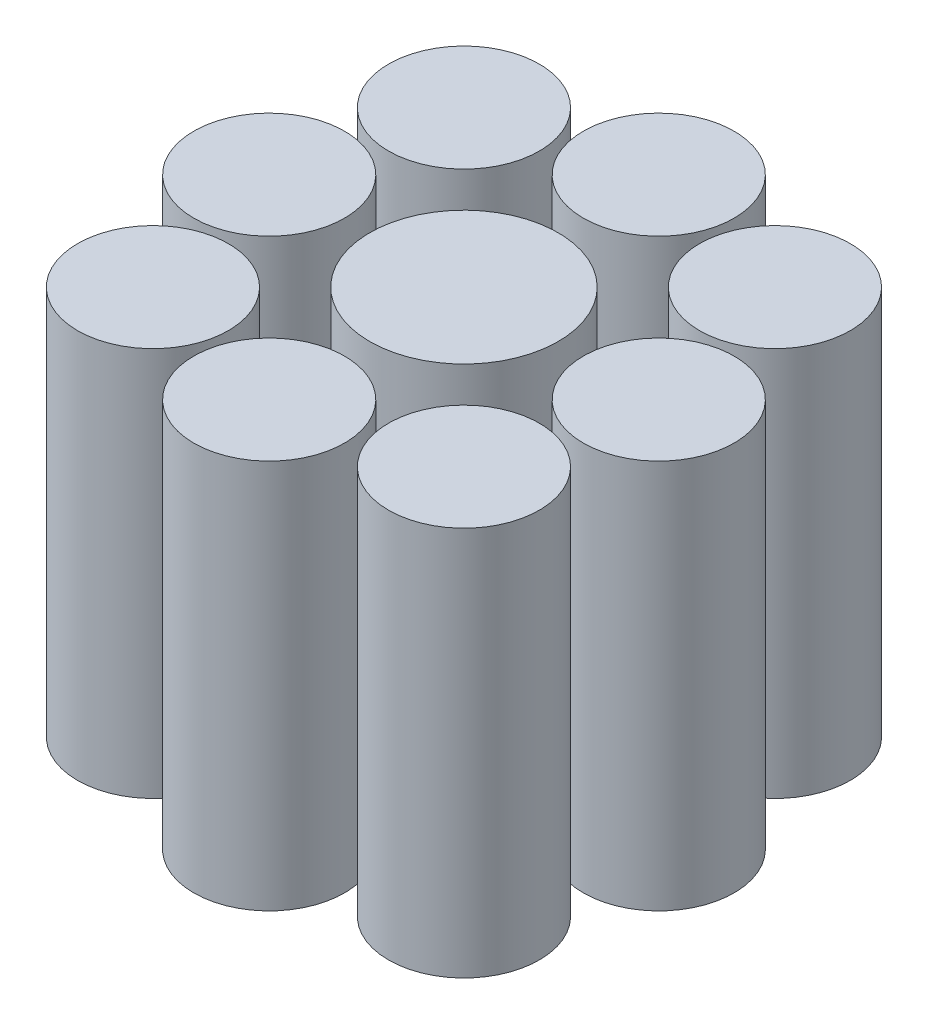
ISO-10303-21;
HEADER;
FILE_DESCRIPTION(('STEP AP214'),'2;1');
FILE_NAME('part.step','',(''),(''),'','','');
FILE_SCHEMA(('AUTOMOTIVE_DESIGN { 1 0 10303 214 1 1 1 1 }'));
ENDSEC;
DATA;
#1=APPLICATION_CONTEXT('core data for automotive mechanical design processes');
#2=APPLICATION_PROTOCOL_DEFINITION('international standard','automotive_design',2000,#1);
#3=PRODUCT_CONTEXT('',#1,'mechanical');
#4=PRODUCT('Part','Part','',(#3));
#5=PRODUCT_RELATED_PRODUCT_CATEGORY('part','',(#4));
#6=PRODUCT_DEFINITION_FORMATION('','',#4);
#7=PRODUCT_DEFINITION_CONTEXT('part definition',#1,'design');
#8=PRODUCT_DEFINITION('design','',#6,#7);
#9=PRODUCT_DEFINITION_SHAPE('','',#8);
#10=(LENGTH_UNIT() NAMED_UNIT(*) SI_UNIT(.MILLI.,.METRE.));
#11=(NAMED_UNIT(*) PLANE_ANGLE_UNIT() SI_UNIT($,.RADIAN.));
#12=(NAMED_UNIT(*) SI_UNIT($,.STERADIAN.) SOLID_ANGLE_UNIT());
#13=UNCERTAINTY_MEASURE_WITH_UNIT(LENGTH_MEASURE(1.E-05),#10,'distance_accuracy_value','');
#14=(GEOMETRIC_REPRESENTATION_CONTEXT(3) GLOBAL_UNCERTAINTY_ASSIGNED_CONTEXT((#13)) GLOBAL_UNIT_ASSIGNED_CONTEXT((#10,
#11,#12)) REPRESENTATION_CONTEXT('',''));
#15=CARTESIAN_POINT('',(0.,0.,0.));
#16=DIRECTION('',(0.,0.,1.));
#17=DIRECTION('',(1.,0.,0.));
#18=AXIS2_PLACEMENT_3D('',#15,#16,#17);
#19=CARTESIAN_POINT('',(24.7487373415292,62.,-24.7487373415291));
#20=DIRECTION('',(0.,-1.,0.));
#21=DIRECTION('',(0.,0.,-1.));
#22=AXIS2_PLACEMENT_3D('',#19,#20,#21);
#23=CYLINDRICAL_SURFACE('',#22,12.);
#24=CARTESIAN_POINT('',(24.7487373415292,62.,-24.7487373415291));
#25=DIRECTION('',(0.,1.,0.));
#26=DIRECTION('',(0.,0.,1.));
#27=AXIS2_PLACEMENT_3D('',#24,#25,#26);
#28=CIRCLE('',#27,12.);
#29=CARTESIAN_POINT('',(24.7487373415292,62.,-12.7487373415291));
#30=VERTEX_POINT('',#29);
#31=EDGE_CURVE('E11',#30,#30,#28,.T.);
#32=ORIENTED_EDGE('',*,*,#31,.F.);
#33=EDGE_LOOP('',(#32));
#34=FACE_BOUND('',#33,.T.);
#35=CARTESIAN_POINT('',(24.7487373415292,0.,-24.7487373415291));
#36=DIRECTION('',(0.,1.,0.));
#37=DIRECTION('',(0.,0.,1.));
#38=AXIS2_PLACEMENT_3D('',#35,#36,#37);
#39=CIRCLE('',#38,12.);
#40=CARTESIAN_POINT('',(24.7487373415292,0.,-12.7487373415291));
#41=VERTEX_POINT('',#40);
#42=EDGE_CURVE('E44',#41,#41,#39,.T.);
#43=ORIENTED_EDGE('',*,*,#42,.T.);
#44=EDGE_LOOP('',(#43));
#45=FACE_BOUND('',#44,.T.);
#46=ADVANCED_FACE('F41',(#34,#45),#23,.T.);
#47=CARTESIAN_POINT('',(24.7487373415292,62.,-24.7487373415291));
#48=DIRECTION('',(0.,1.,0.));
#49=DIRECTION('',(0.,0.,1.));
#50=AXIS2_PLACEMENT_3D('',#47,#48,#49);
#51=PLANE('',#50);
#52=ORIENTED_EDGE('',*,*,#31,.T.);
#53=EDGE_LOOP('',(#52));
#54=FACE_BOUND('',#53,.T.);
#55=ADVANCED_FACE('F56',(#54),#51,.T.);
#56=CARTESIAN_POINT('',(24.7487373415292,0.,-24.7487373415291));
#57=DIRECTION('',(0.,1.,0.));
#58=DIRECTION('',(0.,0.,1.));
#59=AXIS2_PLACEMENT_3D('',#56,#57,#58);
#60=PLANE('',#59);
#61=ORIENTED_EDGE('',*,*,#42,.F.);
#62=EDGE_LOOP('',(#61));
#63=FACE_BOUND('',#62,.T.);
#64=ADVANCED_FACE('F54',(#63),#60,.F.);
#65=CLOSED_SHELL('',(#46,#55,#64));
#66=MANIFOLD_SOLID_BREP('B2',#65);
#67=CARTESIAN_POINT('',(-24.7487373415291,62.,-24.7487373415292));
#68=DIRECTION('',(0.,-1.,0.));
#69=DIRECTION('',(0.,0.,-1.));
#70=AXIS2_PLACEMENT_3D('',#67,#68,#69);
#71=CYLINDRICAL_SURFACE('',#70,12.);
#72=CARTESIAN_POINT('',(-24.7487373415291,62.,-24.7487373415292));
#73=DIRECTION('',(0.,1.,0.));
#74=DIRECTION('',(0.,0.,1.));
#75=AXIS2_PLACEMENT_3D('',#72,#73,#74);
#76=CIRCLE('',#75,12.);
#77=CARTESIAN_POINT('',(-24.7487373415291,62.,-12.7487373415292));
#78=VERTEX_POINT('',#77);
#79=EDGE_CURVE('E40',#78,#78,#76,.T.);
#80=ORIENTED_EDGE('',*,*,#79,.F.);
#81=EDGE_LOOP('',(#80));
#82=FACE_BOUND('',#81,.T.);
#83=CARTESIAN_POINT('',(-24.7487373415291,0.,-24.7487373415292));
#84=DIRECTION('',(0.,1.,0.));
#85=DIRECTION('',(0.,0.,1.));
#86=AXIS2_PLACEMENT_3D('',#83,#84,#85);
#87=CIRCLE('',#86,12.);
#88=CARTESIAN_POINT('',(-24.7487373415291,0.,-12.7487373415292));
#89=VERTEX_POINT('',#88);
#90=EDGE_CURVE('E92',#89,#89,#87,.T.);
#91=ORIENTED_EDGE('',*,*,#90,.T.);
#92=EDGE_LOOP('',(#91));
#93=FACE_BOUND('',#92,.T.);
#94=ADVANCED_FACE('F89',(#82,#93),#71,.T.);
#95=CARTESIAN_POINT('',(-24.7487373415291,62.,-24.7487373415292));
#96=DIRECTION('',(0.,1.,0.));
#97=DIRECTION('',(0.,0.,1.));
#98=AXIS2_PLACEMENT_3D('',#95,#96,#97);
#99=PLANE('',#98);
#100=ORIENTED_EDGE('',*,*,#79,.T.);
#101=EDGE_LOOP('',(#100));
#102=FACE_BOUND('',#101,.T.);
#103=ADVANCED_FACE('F104',(#102),#99,.T.);
#104=CARTESIAN_POINT('',(-24.7487373415291,0.,-24.7487373415292));
#105=DIRECTION('',(0.,1.,0.));
#106=DIRECTION('',(0.,0.,1.));
#107=AXIS2_PLACEMENT_3D('',#104,#105,#106);
#108=PLANE('',#107);
#109=ORIENTED_EDGE('',*,*,#90,.F.);
#110=EDGE_LOOP('',(#109));
#111=FACE_BOUND('',#110,.T.);
#112=ADVANCED_FACE('F102',(#111),#108,.F.);
#113=CLOSED_SHELL('',(#94,#103,#112));
#114=MANIFOLD_SOLID_BREP('B6',#113);
#115=CARTESIAN_POINT('',(-24.7487373415292,62.,24.7487373415291));
#116=DIRECTION('',(0.,-1.,0.));
#117=DIRECTION('',(0.,0.,-1.));
#118=AXIS2_PLACEMENT_3D('',#115,#116,#117);
#119=CYLINDRICAL_SURFACE('',#118,12.);
#120=CARTESIAN_POINT('',(-24.7487373415292,62.,24.7487373415291));
#121=DIRECTION('',(0.,1.,0.));
#122=DIRECTION('',(0.,0.,1.));
#123=AXIS2_PLACEMENT_3D('',#120,#121,#122);
#124=CIRCLE('',#123,12.);
#125=CARTESIAN_POINT('',(-24.7487373415292,62.,36.7487373415291));
#126=VERTEX_POINT('',#125);
#127=EDGE_CURVE('E88',#126,#126,#124,.T.);
#128=ORIENTED_EDGE('',*,*,#127,.F.);
#129=EDGE_LOOP('',(#128));
#130=FACE_BOUND('',#129,.T.);
#131=CARTESIAN_POINT('',(-24.7487373415292,0.,24.7487373415291));
#132=DIRECTION('',(0.,1.,0.));
#133=DIRECTION('',(0.,0.,1.));
#134=AXIS2_PLACEMENT_3D('',#131,#132,#133);
#135=CIRCLE('',#134,12.);
#136=CARTESIAN_POINT('',(-24.7487373415292,0.,36.7487373415291));
#137=VERTEX_POINT('',#136);
#138=EDGE_CURVE('E140',#137,#137,#135,.T.);
#139=ORIENTED_EDGE('',*,*,#138,.T.);
#140=EDGE_LOOP('',(#139));
#141=FACE_BOUND('',#140,.T.);
#142=ADVANCED_FACE('F137',(#130,#141),#119,.T.);
#143=CARTESIAN_POINT('',(-24.7487373415292,62.,24.7487373415291));
#144=DIRECTION('',(0.,1.,0.));
#145=DIRECTION('',(0.,0.,1.));
#146=AXIS2_PLACEMENT_3D('',#143,#144,#145);
#147=PLANE('',#146);
#148=ORIENTED_EDGE('',*,*,#127,.T.);
#149=EDGE_LOOP('',(#148));
#150=FACE_BOUND('',#149,.T.);
#151=ADVANCED_FACE('F152',(#150),#147,.T.);
#152=CARTESIAN_POINT('',(-24.7487373415292,0.,24.7487373415291));
#153=DIRECTION('',(0.,1.,0.));
#154=DIRECTION('',(0.,0.,1.));
#155=AXIS2_PLACEMENT_3D('',#152,#153,#154);
#156=PLANE('',#155);
#157=ORIENTED_EDGE('',*,*,#138,.F.);
#158=EDGE_LOOP('',(#157));
#159=FACE_BOUND('',#158,.T.);
#160=ADVANCED_FACE('F150',(#159),#156,.F.);
#161=CLOSED_SHELL('',(#142,#151,#160));
#162=MANIFOLD_SOLID_BREP('B35',#161);
#163=CARTESIAN_POINT('',(0.,62.,-31.));
#164=DIRECTION('',(0.,-1.,0.));
#165=DIRECTION('',(0.,0.,-1.));
#166=AXIS2_PLACEMENT_3D('',#163,#164,#165);
#167=CYLINDRICAL_SURFACE('',#166,12.);
#168=CARTESIAN_POINT('',(0.,62.,-31.));
#169=DIRECTION('',(0.,1.,0.));
#170=DIRECTION('',(0.,0.,1.));
#171=AXIS2_PLACEMENT_3D('',#168,#169,#170);
#172=CIRCLE('',#171,12.);
#173=CARTESIAN_POINT('',(0.,62.,-19.));
#174=VERTEX_POINT('',#173);
#175=EDGE_CURVE('E136',#174,#174,#172,.T.);
#176=ORIENTED_EDGE('',*,*,#175,.F.);
#177=EDGE_LOOP('',(#176));
#178=FACE_BOUND('',#177,.T.);
#179=CARTESIAN_POINT('',(0.,0.,-31.));
#180=DIRECTION('',(0.,1.,0.));
#181=DIRECTION('',(0.,0.,1.));
#182=AXIS2_PLACEMENT_3D('',#179,#180,#181);
#183=CIRCLE('',#182,12.);
#184=CARTESIAN_POINT('',(0.,0.,-19.));
#185=VERTEX_POINT('',#184);
#186=EDGE_CURVE('E188',#185,#185,#183,.T.);
#187=ORIENTED_EDGE('',*,*,#186,.T.);
#188=EDGE_LOOP('',(#187));
#189=FACE_BOUND('',#188,.T.);
#190=ADVANCED_FACE('F185',(#178,#189),#167,.T.);
#191=CARTESIAN_POINT('',(0.,62.,-31.));
#192=DIRECTION('',(0.,1.,0.));
#193=DIRECTION('',(0.,0.,1.));
#194=AXIS2_PLACEMENT_3D('',#191,#192,#193);
#195=PLANE('',#194);
#196=ORIENTED_EDGE('',*,*,#175,.T.);
#197=EDGE_LOOP('',(#196));
#198=FACE_BOUND('',#197,.T.);
#199=ADVANCED_FACE('F200',(#198),#195,.T.);
#200=CARTESIAN_POINT('',(0.,0.,-31.));
#201=DIRECTION('',(0.,1.,0.));
#202=DIRECTION('',(0.,0.,1.));
#203=AXIS2_PLACEMENT_3D('',#200,#201,#202);
#204=PLANE('',#203);
#205=ORIENTED_EDGE('',*,*,#186,.F.);
#206=EDGE_LOOP('',(#205));
#207=FACE_BOUND('',#206,.T.);
#208=ADVANCED_FACE('F198',(#207),#204,.F.);
#209=CLOSED_SHELL('',(#190,#199,#208));
#210=MANIFOLD_SOLID_BREP('B83',#209);
#211=CARTESIAN_POINT('',(-31.,62.,0.));
#212=DIRECTION('',(0.,-1.,0.));
#213=DIRECTION('',(0.,0.,-1.));
#214=AXIS2_PLACEMENT_3D('',#211,#212,#213);
#215=CYLINDRICAL_SURFACE('',#214,12.);
#216=CARTESIAN_POINT('',(-31.,62.,0.));
#217=DIRECTION('',(0.,1.,0.));
#218=DIRECTION('',(0.,0.,1.));
#219=AXIS2_PLACEMENT_3D('',#216,#217,#218);
#220=CIRCLE('',#219,12.);
#221=CARTESIAN_POINT('',(-31.,62.,12.));
#222=VERTEX_POINT('',#221);
#223=EDGE_CURVE('E184',#222,#222,#220,.T.);
#224=ORIENTED_EDGE('',*,*,#223,.F.);
#225=EDGE_LOOP('',(#224));
#226=FACE_BOUND('',#225,.T.);
#227=CARTESIAN_POINT('',(-31.,0.,0.));
#228=DIRECTION('',(0.,1.,0.));
#229=DIRECTION('',(0.,0.,1.));
#230=AXIS2_PLACEMENT_3D('',#227,#228,#229);
#231=CIRCLE('',#230,12.);
#232=CARTESIAN_POINT('',(-31.,0.,12.));
#233=VERTEX_POINT('',#232);
#234=EDGE_CURVE('E236',#233,#233,#231,.T.);
#235=ORIENTED_EDGE('',*,*,#234,.T.);
#236=EDGE_LOOP('',(#235));
#237=FACE_BOUND('',#236,.T.);
#238=ADVANCED_FACE('F233',(#226,#237),#215,.T.);
#239=CARTESIAN_POINT('',(-31.,62.,0.));
#240=DIRECTION('',(0.,1.,0.));
#241=DIRECTION('',(0.,0.,1.));
#242=AXIS2_PLACEMENT_3D('',#239,#240,#241);
#243=PLANE('',#242);
#244=ORIENTED_EDGE('',*,*,#223,.T.);
#245=EDGE_LOOP('',(#244));
#246=FACE_BOUND('',#245,.T.);
#247=ADVANCED_FACE('F248',(#246),#243,.T.);
#248=CARTESIAN_POINT('',(-31.,0.,0.));
#249=DIRECTION('',(0.,1.,0.));
#250=DIRECTION('',(0.,0.,1.));
#251=AXIS2_PLACEMENT_3D('',#248,#249,#250);
#252=PLANE('',#251);
#253=ORIENTED_EDGE('',*,*,#234,.F.);
#254=EDGE_LOOP('',(#253));
#255=FACE_BOUND('',#254,.T.);
#256=ADVANCED_FACE('F246',(#255),#252,.F.);
#257=CLOSED_SHELL('',(#238,#247,#256));
#258=MANIFOLD_SOLID_BREP('B131',#257);
#259=CARTESIAN_POINT('',(0.,62.,31.));
#260=DIRECTION('',(0.,-1.,0.));
#261=DIRECTION('',(0.,0.,-1.));
#262=AXIS2_PLACEMENT_3D('',#259,#260,#261);
#263=CYLINDRICAL_SURFACE('',#262,12.);
#264=CARTESIAN_POINT('',(0.,62.,31.));
#265=DIRECTION('',(0.,1.,0.));
#266=DIRECTION('',(0.,0.,1.));
#267=AXIS2_PLACEMENT_3D('',#264,#265,#266);
#268=CIRCLE('',#267,12.);
#269=CARTESIAN_POINT('',(0.,62.,43.));
#270=VERTEX_POINT('',#269);
#271=EDGE_CURVE('E232',#270,#270,#268,.T.);
#272=ORIENTED_EDGE('',*,*,#271,.F.);
#273=EDGE_LOOP('',(#272));
#274=FACE_BOUND('',#273,.T.);
#275=CARTESIAN_POINT('',(0.,0.,31.));
#276=DIRECTION('',(0.,1.,0.));
#277=DIRECTION('',(0.,0.,1.));
#278=AXIS2_PLACEMENT_3D('',#275,#276,#277);
#279=CIRCLE('',#278,12.);
#280=CARTESIAN_POINT('',(0.,0.,43.));
#281=VERTEX_POINT('',#280);
#282=EDGE_CURVE('E284',#281,#281,#279,.T.);
#283=ORIENTED_EDGE('',*,*,#282,.T.);
#284=EDGE_LOOP('',(#283));
#285=FACE_BOUND('',#284,.T.);
#286=ADVANCED_FACE('F281',(#274,#285),#263,.T.);
#287=CARTESIAN_POINT('',(0.,62.,31.));
#288=DIRECTION('',(0.,1.,0.));
#289=DIRECTION('',(0.,0.,1.));
#290=AXIS2_PLACEMENT_3D('',#287,#288,#289);
#291=PLANE('',#290);
#292=ORIENTED_EDGE('',*,*,#271,.T.);
#293=EDGE_LOOP('',(#292));
#294=FACE_BOUND('',#293,.T.);
#295=ADVANCED_FACE('F296',(#294),#291,.T.);
#296=CARTESIAN_POINT('',(0.,0.,31.));
#297=DIRECTION('',(0.,1.,0.));
#298=DIRECTION('',(0.,0.,1.));
#299=AXIS2_PLACEMENT_3D('',#296,#297,#298);
#300=PLANE('',#299);
#301=ORIENTED_EDGE('',*,*,#282,.F.);
#302=EDGE_LOOP('',(#301));
#303=FACE_BOUND('',#302,.T.);
#304=ADVANCED_FACE('F294',(#303),#300,.F.);
#305=CLOSED_SHELL('',(#286,#295,#304));
#306=MANIFOLD_SOLID_BREP('B179',#305);
#307=CARTESIAN_POINT('',(24.7487373415291,62.,24.7487373415292));
#308=DIRECTION('',(0.,-1.,0.));
#309=DIRECTION('',(0.,0.,-1.));
#310=AXIS2_PLACEMENT_3D('',#307,#308,#309);
#311=CYLINDRICAL_SURFACE('',#310,12.);
#312=CARTESIAN_POINT('',(24.7487373415291,62.,24.7487373415292));
#313=DIRECTION('',(0.,1.,0.));
#314=DIRECTION('',(0.,0.,1.));
#315=AXIS2_PLACEMENT_3D('',#312,#313,#314);
#316=CIRCLE('',#315,12.);
#317=CARTESIAN_POINT('',(24.7487373415291,62.,36.7487373415292));
#318=VERTEX_POINT('',#317);
#319=EDGE_CURVE('E280',#318,#318,#316,.T.);
#320=ORIENTED_EDGE('',*,*,#319,.F.);
#321=EDGE_LOOP('',(#320));
#322=FACE_BOUND('',#321,.T.);
#323=CARTESIAN_POINT('',(24.7487373415291,0.,24.7487373415292));
#324=DIRECTION('',(0.,1.,0.));
#325=DIRECTION('',(0.,0.,1.));
#326=AXIS2_PLACEMENT_3D('',#323,#324,#325);
#327=CIRCLE('',#326,12.);
#328=CARTESIAN_POINT('',(24.7487373415291,0.,36.7487373415292));
#329=VERTEX_POINT('',#328);
#330=EDGE_CURVE('E332',#329,#329,#327,.T.);
#331=ORIENTED_EDGE('',*,*,#330,.T.);
#332=EDGE_LOOP('',(#331));
#333=FACE_BOUND('',#332,.T.);
#334=ADVANCED_FACE('F329',(#322,#333),#311,.T.);
#335=CARTESIAN_POINT('',(24.7487373415291,62.,24.7487373415292));
#336=DIRECTION('',(0.,1.,0.));
#337=DIRECTION('',(0.,0.,1.));
#338=AXIS2_PLACEMENT_3D('',#335,#336,#337);
#339=PLANE('',#338);
#340=ORIENTED_EDGE('',*,*,#319,.T.);
#341=EDGE_LOOP('',(#340));
#342=FACE_BOUND('',#341,.T.);
#343=ADVANCED_FACE('F344',(#342),#339,.T.);
#344=CARTESIAN_POINT('',(24.7487373415291,0.,24.7487373415292));
#345=DIRECTION('',(0.,1.,0.));
#346=DIRECTION('',(0.,0.,1.));
#347=AXIS2_PLACEMENT_3D('',#344,#345,#346);
#348=PLANE('',#347);
#349=ORIENTED_EDGE('',*,*,#330,.F.);
#350=EDGE_LOOP('',(#349));
#351=FACE_BOUND('',#350,.T.);
#352=ADVANCED_FACE('F342',(#351),#348,.F.);
#353=CLOSED_SHELL('',(#334,#343,#352));
#354=MANIFOLD_SOLID_BREP('B227',#353);
#355=CARTESIAN_POINT('',(31.,62.,0.));
#356=DIRECTION('',(0.,-1.,0.));
#357=DIRECTION('',(0.,0.,-1.));
#358=AXIS2_PLACEMENT_3D('',#355,#356,#357);
#359=CYLINDRICAL_SURFACE('',#358,12.);
#360=CARTESIAN_POINT('',(31.,62.,0.));
#361=DIRECTION('',(0.,1.,0.));
#362=DIRECTION('',(0.,0.,1.));
#363=AXIS2_PLACEMENT_3D('',#360,#361,#362);
#364=CIRCLE('',#363,12.);
#365=CARTESIAN_POINT('',(31.,62.,12.));
#366=VERTEX_POINT('',#365);
#367=EDGE_CURVE('E328',#366,#366,#364,.T.);
#368=ORIENTED_EDGE('',*,*,#367,.F.);
#369=EDGE_LOOP('',(#368));
#370=FACE_BOUND('',#369,.T.);
#371=CARTESIAN_POINT('',(31.,0.,0.));
#372=DIRECTION('',(0.,1.,0.));
#373=DIRECTION('',(0.,0.,1.));
#374=AXIS2_PLACEMENT_3D('',#371,#372,#373);
#375=CIRCLE('',#374,12.);
#376=CARTESIAN_POINT('',(31.,0.,12.));
#377=VERTEX_POINT('',#376);
#378=EDGE_CURVE('E379',#377,#377,#375,.T.);
#379=ORIENTED_EDGE('',*,*,#378,.T.);
#380=EDGE_LOOP('',(#379));
#381=FACE_BOUND('',#380,.T.);
#382=ADVANCED_FACE('F376',(#370,#381),#359,.T.);
#383=CARTESIAN_POINT('',(31.,62.,0.));
#384=DIRECTION('',(0.,1.,0.));
#385=DIRECTION('',(0.,0.,1.));
#386=AXIS2_PLACEMENT_3D('',#383,#384,#385);
#387=PLANE('',#386);
#388=ORIENTED_EDGE('',*,*,#367,.T.);
#389=EDGE_LOOP('',(#388));
#390=FACE_BOUND('',#389,.T.);
#391=ADVANCED_FACE('F391',(#390),#387,.T.);
#392=CARTESIAN_POINT('',(31.,0.,0.));
#393=DIRECTION('',(0.,1.,0.));
#394=DIRECTION('',(0.,0.,1.));
#395=AXIS2_PLACEMENT_3D('',#392,#393,#394);
#396=PLANE('',#395);
#397=ORIENTED_EDGE('',*,*,#378,.F.);
#398=EDGE_LOOP('',(#397));
#399=FACE_BOUND('',#398,.T.);
#400=ADVANCED_FACE('F389',(#399),#396,.F.);
#401=CLOSED_SHELL('',(#382,#391,#400));
#402=MANIFOLD_SOLID_BREP('B275',#401);
#403=CARTESIAN_POINT('',(0.,62.,0.));
#404=DIRECTION('',(0.,-1.,0.));
#405=DIRECTION('',(0.,0.,-1.));
#406=AXIS2_PLACEMENT_3D('',#403,#404,#405);
#407=CYLINDRICAL_SURFACE('',#406,15.);
#408=CARTESIAN_POINT('',(0.,62.,0.));
#409=DIRECTION('',(0.,1.,0.));
#410=DIRECTION('',(0.,0.,1.));
#411=AXIS2_PLACEMENT_3D('',#408,#409,#410);
#412=CIRCLE('',#411,15.);
#413=CARTESIAN_POINT('',(0.,62.,15.));
#414=VERTEX_POINT('',#413);
#415=EDGE_CURVE('E375',#414,#414,#412,.T.);
#416=ORIENTED_EDGE('',*,*,#415,.F.);
#417=EDGE_LOOP('',(#416));
#418=FACE_BOUND('',#417,.T.);
#419=CARTESIAN_POINT('',(0.,0.,0.));
#420=DIRECTION('',(0.,1.,0.));
#421=DIRECTION('',(0.,0.,1.));
#422=AXIS2_PLACEMENT_3D('',#419,#420,#421);
#423=CIRCLE('',#422,15.);
#424=CARTESIAN_POINT('',(0.,0.,15.));
#425=VERTEX_POINT('',#424);
#426=EDGE_CURVE('E419',#425,#425,#423,.T.);
#427=ORIENTED_EDGE('',*,*,#426,.T.);
#428=EDGE_LOOP('',(#427));
#429=FACE_BOUND('',#428,.T.);
#430=ADVANCED_FACE('F416',(#418,#429),#407,.T.);
#431=CARTESIAN_POINT('',(0.,62.,0.));
#432=DIRECTION('',(0.,1.,0.));
#433=DIRECTION('',(0.,0.,1.));
#434=AXIS2_PLACEMENT_3D('',#431,#432,#433);
#435=PLANE('',#434);
#436=ORIENTED_EDGE('',*,*,#415,.T.);
#437=EDGE_LOOP('',(#436));
#438=FACE_BOUND('',#437,.T.);
#439=ADVANCED_FACE('F431',(#438),#435,.T.);
#440=CARTESIAN_POINT('',(0.,0.,0.));
#441=DIRECTION('',(0.,1.,0.));
#442=DIRECTION('',(0.,0.,1.));
#443=AXIS2_PLACEMENT_3D('',#440,#441,#442);
#444=PLANE('',#443);
#445=ORIENTED_EDGE('',*,*,#426,.F.);
#446=EDGE_LOOP('',(#445));
#447=FACE_BOUND('',#446,.T.);
#448=ADVANCED_FACE('F429',(#447),#444,.F.);
#449=CLOSED_SHELL('',(#430,#439,#448));
#450=MANIFOLD_SOLID_BREP('B323',#449);
#451=ADVANCED_BREP_SHAPE_REPRESENTATION('',(#18,#66,#114,#162,#210,#258,#306,#354,#402,#450),#14);
#452=SHAPE_DEFINITION_REPRESENTATION(#9,#451);
ENDSEC;
END-ISO-10303-21;
